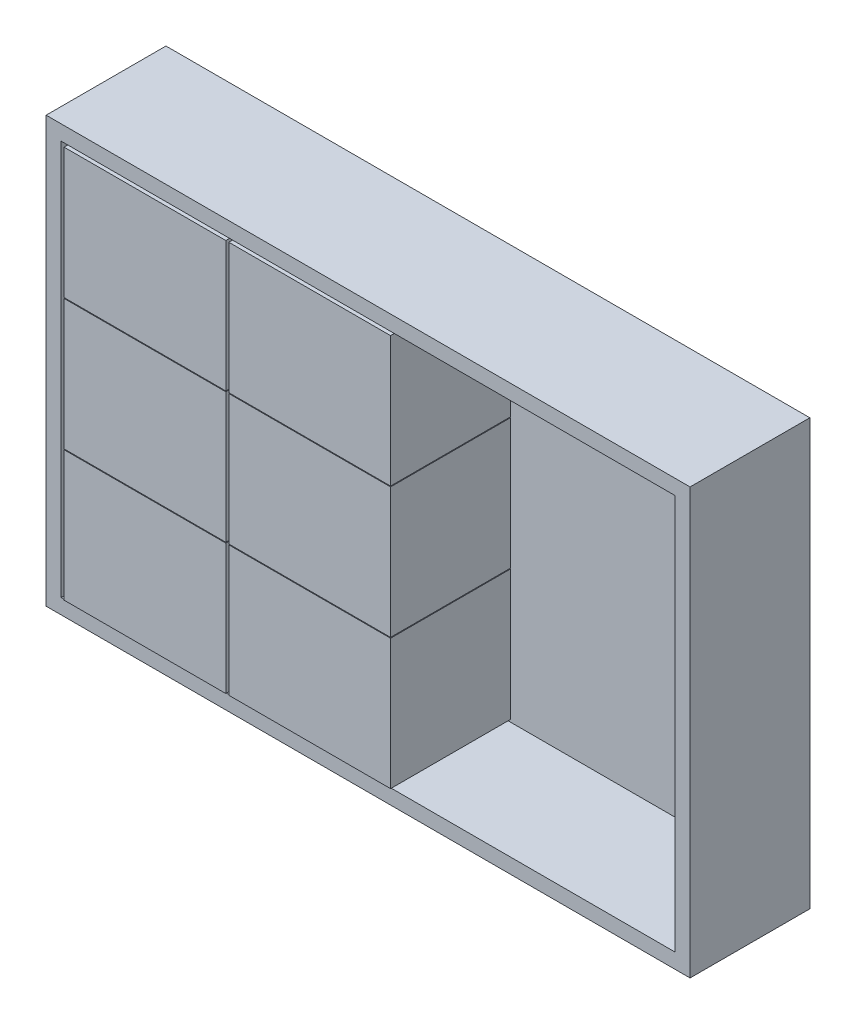
ISO-10303-21;
HEADER;
FILE_DESCRIPTION(('STEP AP214'),'2;1');
FILE_NAME('part.step','',(''),(''),'','','');
FILE_SCHEMA(('AUTOMOTIVE_DESIGN { 1 0 10303 214 1 1 1 1 }'));
ENDSEC;
DATA;
#1=APPLICATION_CONTEXT('core data for automotive mechanical design processes');
#2=APPLICATION_PROTOCOL_DEFINITION('international standard','automotive_design',2000,#1);
#3=PRODUCT_CONTEXT('',#1,'mechanical');
#4=PRODUCT('Part','Part','',(#3));
#5=PRODUCT_RELATED_PRODUCT_CATEGORY('part','',(#4));
#6=PRODUCT_DEFINITION_FORMATION('','',#4);
#7=PRODUCT_DEFINITION_CONTEXT('part definition',#1,'design');
#8=PRODUCT_DEFINITION('design','',#6,#7);
#9=PRODUCT_DEFINITION_SHAPE('','',#8);
#10=(LENGTH_UNIT() NAMED_UNIT(*) SI_UNIT(.MILLI.,.METRE.));
#11=(NAMED_UNIT(*) PLANE_ANGLE_UNIT() SI_UNIT($,.RADIAN.));
#12=(NAMED_UNIT(*) SI_UNIT($,.STERADIAN.) SOLID_ANGLE_UNIT());
#13=UNCERTAINTY_MEASURE_WITH_UNIT(LENGTH_MEASURE(1.E-05),#10,'distance_accuracy_value','');
#14=(GEOMETRIC_REPRESENTATION_CONTEXT(3) GLOBAL_UNCERTAINTY_ASSIGNED_CONTEXT((#13)) GLOBAL_UNIT_ASSIGNED_CONTEXT((#10,
#11,#12)) REPRESENTATION_CONTEXT('',''));
#15=CARTESIAN_POINT('',(0.,0.,0.));
#16=DIRECTION('',(0.,0.,1.));
#17=DIRECTION('',(1.,0.,0.));
#18=AXIS2_PLACEMENT_3D('',#15,#16,#17);
#19=CARTESIAN_POINT('',(0.,0.,1.));
#20=DIRECTION('',(0.,0.,-1.));
#21=DIRECTION('',(-1.,0.,0.));
#22=AXIS2_PLACEMENT_3D('',#19,#20,#21);
#23=PLANE('',#22);
#24=DIRECTION('',(0.,-1.,0.));
#25=VECTOR('',#24,1.);
#26=CARTESIAN_POINT('',(57.,88.,1.));
#27=LINE('',#26,#25);
#28=CARTESIAN_POINT('',(57.,88.,1.));
#29=VERTEX_POINT('',#28);
#30=CARTESIAN_POINT('',(57.,44.5,1.));
#31=VERTEX_POINT('',#30);
#32=EDGE_CURVE('E322',#29,#31,#27,.T.);
#33=ORIENTED_EDGE('',*,*,#32,.F.);
#34=DIRECTION('',(-1.,0.,0.));
#35=VECTOR('',#34,1.);
#36=CARTESIAN_POINT('',(57.,88.,1.));
#37=LINE('',#36,#35);
#38=CARTESIAN_POINT('',(111.,88.,1.));
#39=VERTEX_POINT('',#38);
#40=EDGE_CURVE('E288',#39,#29,#37,.T.);
#41=ORIENTED_EDGE('',*,*,#40,.F.);
#42=DIRECTION('',(0.,1.,0.));
#43=VECTOR('',#42,1.);
#44=CARTESIAN_POINT('',(111.,88.,1.));
#45=LINE('',#44,#43);
#46=CARTESIAN_POINT('',(111.,44.5,1.));
#47=VERTEX_POINT('',#46);
#48=EDGE_CURVE('E310',#47,#39,#45,.T.);
#49=ORIENTED_EDGE('',*,*,#48,.F.);
#50=DIRECTION('',(1.,0.,0.));
#51=VECTOR('',#50,1.);
#52=CARTESIAN_POINT('',(57.,44.5,1.));
#53=LINE('',#52,#51);
#54=EDGE_CURVE('E316',#31,#47,#53,.T.);
#55=ORIENTED_EDGE('',*,*,#54,.F.);
#56=EDGE_LOOP('',(#33,#41,#49,#55));
#57=FACE_BOUND('',#56,.T.);
#58=DIRECTION('',(0.,-1.,0.));
#59=VECTOR('',#58,1.);
#60=CARTESIAN_POINT('',(2.,44.25,1.));
#61=LINE('',#60,#59);
#62=CARTESIAN_POINT('',(2.,44.25,1.));
#63=VERTEX_POINT('',#62);
#64=CARTESIAN_POINT('',(2.00000000000001,0.750000000000015,1.));
#65=VERTEX_POINT('',#64);
#66=EDGE_CURVE('E388',#63,#65,#61,.T.);
#67=ORIENTED_EDGE('',*,*,#66,.F.);
#68=DIRECTION('',(-1.,0.,0.));
#69=VECTOR('',#68,1.);
#70=CARTESIAN_POINT('',(2.,44.25,1.));
#71=LINE('',#70,#69);
#72=CARTESIAN_POINT('',(56.,44.25,1.));
#73=VERTEX_POINT('',#72);
#74=EDGE_CURVE('E358',#73,#63,#71,.T.);
#75=ORIENTED_EDGE('',*,*,#74,.F.);
#76=DIRECTION('',(0.,1.,0.));
#77=VECTOR('',#76,1.);
#78=CARTESIAN_POINT('',(56.,44.25,1.));
#79=LINE('',#78,#77);
#80=CARTESIAN_POINT('',(56.,0.750000000000015,1.));
#81=VERTEX_POINT('',#80);
#82=EDGE_CURVE('E376',#81,#73,#79,.T.);
#83=ORIENTED_EDGE('',*,*,#82,.F.);
#84=DIRECTION('',(1.,0.,0.));
#85=VECTOR('',#84,1.);
#86=CARTESIAN_POINT('',(2.00000000000001,0.750000000000015,1.));
#87=LINE('',#86,#85);
#88=EDGE_CURVE('E382',#65,#81,#87,.T.);
#89=ORIENTED_EDGE('',*,*,#88,.F.);
#90=EDGE_LOOP('',(#67,#75,#83,#89));
#91=FACE_BOUND('',#90,.T.);
#92=DIRECTION('',(0.,-1.,0.));
#93=VECTOR('',#92,1.);
#94=CARTESIAN_POINT('',(2.,131.75,1.));
#95=LINE('',#94,#93);
#96=CARTESIAN_POINT('',(2.,131.75,1.));
#97=VERTEX_POINT('',#96);
#98=CARTESIAN_POINT('',(2.00000000000001,88.25,1.));
#99=VERTEX_POINT('',#98);
#100=EDGE_CURVE('E424',#97,#99,#95,.T.);
#101=ORIENTED_EDGE('',*,*,#100,.F.);
#102=DIRECTION('',(-1.,0.,0.));
#103=VECTOR('',#102,1.);
#104=CARTESIAN_POINT('',(2.,131.75,1.));
#105=LINE('',#104,#103);
#106=CARTESIAN_POINT('',(56.,131.75,1.));
#107=VERTEX_POINT('',#106);
#108=EDGE_CURVE('E429',#107,#97,#105,.T.);
#109=ORIENTED_EDGE('',*,*,#108,.F.);
#110=DIRECTION('',(0.,1.,0.));
#111=VECTOR('',#110,1.);
#112=CARTESIAN_POINT('',(56.,131.75,1.));
#113=LINE('',#112,#111);
#114=CARTESIAN_POINT('',(56.,88.25,1.));
#115=VERTEX_POINT('',#114);
#116=EDGE_CURVE('E441',#115,#107,#113,.T.);
#117=ORIENTED_EDGE('',*,*,#116,.F.);
#118=DIRECTION('',(1.,0.,0.));
#119=VECTOR('',#118,1.);
#120=CARTESIAN_POINT('',(2.00000000000001,88.25,1.));
#121=LINE('',#120,#119);
#122=EDGE_CURVE('E438',#99,#115,#121,.T.);
#123=ORIENTED_EDGE('',*,*,#122,.F.);
#124=EDGE_LOOP('',(#101,#109,#117,#123));
#125=FACE_BOUND('',#124,.T.);
#126=DIRECTION('',(0.,-1.,0.));
#127=VECTOR('',#126,1.);
#128=CARTESIAN_POINT('',(0.,0.,1.));
#129=LINE('',#128,#127);
#130=CARTESIAN_POINT('',(0.,132.,1.));
#131=VERTEX_POINT('',#130);
#132=CARTESIAN_POINT('',(0.,0.,1.));
#133=VERTEX_POINT('',#132);
#134=EDGE_CURVE('E507',#131,#133,#129,.T.);
#135=ORIENTED_EDGE('',*,*,#134,.T.);
#136=DIRECTION('',(1.,0.,0.));
#137=VECTOR('',#136,1.);
#138=CARTESIAN_POINT('',(0.,0.,1.));
#139=LINE('',#138,#137);
#140=CARTESIAN_POINT('',(205.,0.,1.));
#141=VERTEX_POINT('',#140);
#142=EDGE_CURVE('E510',#133,#141,#139,.T.);
#143=ORIENTED_EDGE('',*,*,#142,.T.);
#144=DIRECTION('',(0.,1.,0.));
#145=VECTOR('',#144,1.);
#146=CARTESIAN_POINT('',(205.,0.,1.));
#147=LINE('',#146,#145);
#148=CARTESIAN_POINT('',(205.,132.,1.));
#149=VERTEX_POINT('',#148);
#150=EDGE_CURVE('E65',#141,#149,#147,.T.);
#151=ORIENTED_EDGE('',*,*,#150,.T.);
#152=DIRECTION('',(-1.,0.,0.));
#153=VECTOR('',#152,1.);
#154=CARTESIAN_POINT('',(0.,132.,1.));
#155=LINE('',#154,#153);
#156=EDGE_CURVE('E12',#149,#131,#155,.T.);
#157=ORIENTED_EDGE('',*,*,#156,.T.);
#158=EDGE_LOOP('',(#135,#143,#151,#157));
#159=FACE_BOUND('',#158,.T.);
#160=DIRECTION('',(0.,-1.,0.));
#161=VECTOR('',#160,1.);
#162=CARTESIAN_POINT('',(2.,88.,1.));
#163=LINE('',#162,#161);
#164=CARTESIAN_POINT('',(2.,88.,1.));
#165=VERTEX_POINT('',#164);
#166=CARTESIAN_POINT('',(2.00000000000001,44.5,1.));
#167=VERTEX_POINT('',#166);
#168=EDGE_CURVE('E421',#165,#167,#163,.T.);
#169=ORIENTED_EDGE('',*,*,#168,.F.);
#170=DIRECTION('',(-1.,0.,0.));
#171=VECTOR('',#170,1.);
#172=CARTESIAN_POINT('',(2.,88.,1.));
#173=LINE('',#172,#171);
#174=CARTESIAN_POINT('',(56.,88.,1.));
#175=VERTEX_POINT('',#174);
#176=EDGE_CURVE('E391',#175,#165,#173,.T.);
#177=ORIENTED_EDGE('',*,*,#176,.F.);
#178=DIRECTION('',(0.,1.,0.));
#179=VECTOR('',#178,1.);
#180=CARTESIAN_POINT('',(56.,88.,1.));
#181=LINE('',#180,#179);
#182=CARTESIAN_POINT('',(56.,44.5,1.));
#183=VERTEX_POINT('',#182);
#184=EDGE_CURVE('E409',#183,#175,#181,.T.);
#185=ORIENTED_EDGE('',*,*,#184,.F.);
#186=DIRECTION('',(1.,0.,0.));
#187=VECTOR('',#186,1.);
#188=CARTESIAN_POINT('',(2.00000000000001,44.5,1.));
#189=LINE('',#188,#187);
#190=EDGE_CURVE('E415',#167,#183,#189,.T.);
#191=ORIENTED_EDGE('',*,*,#190,.F.);
#192=EDGE_LOOP('',(#169,#177,#185,#191));
#193=FACE_BOUND('',#192,.T.);
#194=DIRECTION('',(0.,-1.,0.));
#195=VECTOR('',#194,1.);
#196=CARTESIAN_POINT('',(57.,131.75,1.));
#197=LINE('',#196,#195);
#198=CARTESIAN_POINT('',(57.,131.75,1.));
#199=VERTEX_POINT('',#198);
#200=CARTESIAN_POINT('',(57.,88.25,1.));
#201=VERTEX_POINT('',#200);
#202=EDGE_CURVE('E355',#199,#201,#197,.T.);
#203=ORIENTED_EDGE('',*,*,#202,.F.);
#204=DIRECTION('',(-1.,0.,0.));
#205=VECTOR('',#204,1.);
#206=CARTESIAN_POINT('',(57.,131.75,1.));
#207=LINE('',#206,#205);
#208=CARTESIAN_POINT('',(111.,131.75,1.));
#209=VERTEX_POINT('',#208);
#210=EDGE_CURVE('E325',#209,#199,#207,.T.);
#211=ORIENTED_EDGE('',*,*,#210,.F.);
#212=DIRECTION('',(0.,1.,0.));
#213=VECTOR('',#212,1.);
#214=CARTESIAN_POINT('',(111.,131.75,1.));
#215=LINE('',#214,#213);
#216=CARTESIAN_POINT('',(111.,88.25,1.));
#217=VERTEX_POINT('',#216);
#218=EDGE_CURVE('E343',#217,#209,#215,.T.);
#219=ORIENTED_EDGE('',*,*,#218,.F.);
#220=DIRECTION('',(1.,0.,0.));
#221=VECTOR('',#220,1.);
#222=CARTESIAN_POINT('',(57.,88.25,1.));
#223=LINE('',#222,#221);
#224=EDGE_CURVE('E349',#201,#217,#223,.T.);
#225=ORIENTED_EDGE('',*,*,#224,.F.);
#226=EDGE_LOOP('',(#203,#211,#219,#225));
#227=FACE_BOUND('',#226,.T.);
#228=DIRECTION('',(0.,-1.,0.));
#229=VECTOR('',#228,1.);
#230=CARTESIAN_POINT('',(57.,44.25,1.));
#231=LINE('',#230,#229);
#232=CARTESIAN_POINT('',(57.,44.25,1.));
#233=VERTEX_POINT('',#232);
#234=CARTESIAN_POINT('',(57.,0.750000000000015,1.));
#235=VERTEX_POINT('',#234);
#236=EDGE_CURVE('E286',#233,#235,#231,.T.);
#237=ORIENTED_EDGE('',*,*,#236,.F.);
#238=DIRECTION('',(-1.,0.,0.));
#239=VECTOR('',#238,1.);
#240=CARTESIAN_POINT('',(57.,44.25,1.));
#241=LINE('',#240,#239);
#242=CARTESIAN_POINT('',(111.,44.25,1.));
#243=VERTEX_POINT('',#242);
#244=EDGE_CURVE('E275',#243,#233,#241,.T.);
#245=ORIENTED_EDGE('',*,*,#244,.F.);
#246=DIRECTION('',(0.,1.,0.));
#247=VECTOR('',#246,1.);
#248=CARTESIAN_POINT('',(111.,44.25,1.));
#249=LINE('',#248,#247);
#250=CARTESIAN_POINT('',(111.,0.750000000000015,1.));
#251=VERTEX_POINT('',#250);
#252=EDGE_CURVE('E77',#251,#243,#249,.T.);
#253=ORIENTED_EDGE('',*,*,#252,.F.);
#254=DIRECTION('',(1.,0.,0.));
#255=VECTOR('',#254,1.);
#256=CARTESIAN_POINT('',(57.,0.750000000000015,1.));
#257=LINE('',#256,#255);
#258=EDGE_CURVE('E72',#235,#251,#257,.T.);
#259=ORIENTED_EDGE('',*,*,#258,.F.);
#260=EDGE_LOOP('',(#237,#245,#253,#259));
#261=FACE_BOUND('',#260,.T.);
#262=ADVANCED_FACE('F57',(#57,#91,#125,#159,#193,#227,#261),#23,.F.);
#263=CARTESIAN_POINT('',(0.,0.,40.));
#264=DIRECTION('',(1.,0.,0.));
#265=DIRECTION('',(0.,0.,-1.));
#266=AXIS2_PLACEMENT_3D('',#263,#264,#265);
#267=PLANE('',#266);
#268=ORIENTED_EDGE('',*,*,#134,.F.);
#269=DIRECTION('',(0.,0.,-1.));
#270=VECTOR('',#269,1.);
#271=CARTESIAN_POINT('',(0.,132.,40.));
#272=LINE('',#271,#270);
#273=CARTESIAN_POINT('',(0.,132.,40.));
#274=VERTEX_POINT('',#273);
#275=EDGE_CURVE('E466',#274,#131,#272,.T.);
#276=ORIENTED_EDGE('',*,*,#275,.F.);
#277=DIRECTION('',(0.,-1.,0.));
#278=VECTOR('',#277,1.);
#279=CARTESIAN_POINT('',(0.,0.,40.));
#280=LINE('',#279,#278);
#281=CARTESIAN_POINT('',(0.,0.,40.));
#282=VERTEX_POINT('',#281);
#283=EDGE_CURVE('E457',#274,#282,#280,.T.);
#284=ORIENTED_EDGE('',*,*,#283,.T.);
#285=DIRECTION('',(0.,0.,-1.));
#286=VECTOR('',#285,1.);
#287=CARTESIAN_POINT('',(0.,0.,40.));
#288=LINE('',#287,#286);
#289=EDGE_CURVE('E474',#282,#133,#288,.T.);
#290=ORIENTED_EDGE('',*,*,#289,.T.);
#291=EDGE_LOOP('',(#268,#276,#284,#290));
#292=FACE_BOUND('',#291,.T.);
#293=ADVANCED_FACE('F532',(#292),#267,.T.);
#294=CARTESIAN_POINT('',(0.,0.,40.));
#295=DIRECTION('',(0.,1.,0.));
#296=DIRECTION('',(0.,0.,1.));
#297=AXIS2_PLACEMENT_3D('',#294,#295,#296);
#298=PLANE('',#297);
#299=ORIENTED_EDGE('',*,*,#142,.F.);
#300=ORIENTED_EDGE('',*,*,#289,.F.);
#301=DIRECTION('',(1.,0.,0.));
#302=VECTOR('',#301,1.);
#303=CARTESIAN_POINT('',(0.,0.,40.));
#304=LINE('',#303,#302);
#305=CARTESIAN_POINT('',(205.,0.,40.));
#306=VERTEX_POINT('',#305);
#307=EDGE_CURVE('E459',#282,#306,#304,.T.);
#308=ORIENTED_EDGE('',*,*,#307,.T.);
#309=DIRECTION('',(0.,0.,-1.));
#310=VECTOR('',#309,1.);
#311=CARTESIAN_POINT('',(205.,0.,40.));
#312=LINE('',#311,#310);
#313=EDGE_CURVE('E471',#306,#141,#312,.T.);
#314=ORIENTED_EDGE('',*,*,#313,.T.);
#315=EDGE_LOOP('',(#299,#300,#308,#314));
#316=FACE_BOUND('',#315,.T.);
#317=ADVANCED_FACE('F520',(#316),#298,.T.);
#318=CARTESIAN_POINT('',(205.,0.,40.));
#319=DIRECTION('',(-1.,0.,0.));
#320=DIRECTION('',(0.,0.,1.));
#321=AXIS2_PLACEMENT_3D('',#318,#319,#320);
#322=PLANE('',#321);
#323=ORIENTED_EDGE('',*,*,#150,.F.);
#324=ORIENTED_EDGE('',*,*,#313,.F.);
#325=DIRECTION('',(0.,1.,0.));
#326=VECTOR('',#325,1.);
#327=CARTESIAN_POINT('',(205.,0.,40.));
#328=LINE('',#327,#326);
#329=CARTESIAN_POINT('',(205.,132.,40.));
#330=VERTEX_POINT('',#329);
#331=EDGE_CURVE('E461',#306,#330,#328,.T.);
#332=ORIENTED_EDGE('',*,*,#331,.T.);
#333=DIRECTION('',(0.,0.,-1.));
#334=VECTOR('',#333,1.);
#335=CARTESIAN_POINT('',(205.,132.,40.));
#336=LINE('',#335,#334);
#337=EDGE_CURVE('E468',#330,#149,#336,.T.);
#338=ORIENTED_EDGE('',*,*,#337,.T.);
#339=EDGE_LOOP('',(#323,#324,#332,#338));
#340=FACE_BOUND('',#339,.T.);
#341=ADVANCED_FACE('F517',(#340),#322,.T.);
#342=CARTESIAN_POINT('',(0.,132.,40.));
#343=DIRECTION('',(0.,-1.,0.));
#344=DIRECTION('',(0.,0.,-1.));
#345=AXIS2_PLACEMENT_3D('',#342,#343,#344);
#346=PLANE('',#345);
#347=ORIENTED_EDGE('',*,*,#156,.F.);
#348=ORIENTED_EDGE('',*,*,#337,.F.);
#349=DIRECTION('',(-1.,0.,0.));
#350=VECTOR('',#349,1.);
#351=CARTESIAN_POINT('',(0.,132.,40.));
#352=LINE('',#351,#350);
#353=EDGE_CURVE('E464',#330,#274,#352,.T.);
#354=ORIENTED_EDGE('',*,*,#353,.T.);
#355=ORIENTED_EDGE('',*,*,#275,.T.);
#356=EDGE_LOOP('',(#347,#348,#354,#355));
#357=FACE_BOUND('',#356,.T.);
#358=ADVANCED_FACE('F529',(#357),#346,.T.);
#359=CARTESIAN_POINT('',(0.,0.,40.));
#360=DIRECTION('',(0.,0.,1.));
#361=DIRECTION('',(1.,0.,0.));
#362=AXIS2_PLACEMENT_3D('',#359,#360,#361);
#363=PLANE('',#362);
#364=DIRECTION('',(0.,-1.,0.));
#365=VECTOR('',#364,1.);
#366=CARTESIAN_POINT('',(-5.,0.,40.));
#367=LINE('',#366,#365);
#368=CARTESIAN_POINT('',(-5.,137.,40.));
#369=VERTEX_POINT('',#368);
#370=CARTESIAN_POINT('',(-5.,-5.,40.));
#371=VERTEX_POINT('',#370);
#372=EDGE_CURVE('E478',#369,#371,#367,.T.);
#373=ORIENTED_EDGE('',*,*,#372,.T.);
#374=DIRECTION('',(1.,0.,0.));
#375=VECTOR('',#374,1.);
#376=CARTESIAN_POINT('',(0.,-5.,40.));
#377=LINE('',#376,#375);
#378=CARTESIAN_POINT('',(210.,-5.,40.));
#379=VERTEX_POINT('',#378);
#380=EDGE_CURVE('E481',#371,#379,#377,.T.);
#381=ORIENTED_EDGE('',*,*,#380,.T.);
#382=DIRECTION('',(0.,1.,0.));
#383=VECTOR('',#382,1.);
#384=CARTESIAN_POINT('',(210.,0.,40.));
#385=LINE('',#384,#383);
#386=CARTESIAN_POINT('',(210.,137.,40.));
#387=VERTEX_POINT('',#386);
#388=EDGE_CURVE('E484',#379,#387,#385,.T.);
#389=ORIENTED_EDGE('',*,*,#388,.T.);
#390=DIRECTION('',(-1.,0.,0.));
#391=VECTOR('',#390,1.);
#392=CARTESIAN_POINT('',(0.,137.,40.));
#393=LINE('',#392,#391);
#394=EDGE_CURVE('E486',#387,#369,#393,.T.);
#395=ORIENTED_EDGE('',*,*,#394,.T.);
#396=EDGE_LOOP('',(#373,#381,#389,#395));
#397=FACE_BOUND('',#396,.T.);
#398=ORIENTED_EDGE('',*,*,#307,.F.);
#399=ORIENTED_EDGE('',*,*,#283,.F.);
#400=ORIENTED_EDGE('',*,*,#353,.F.);
#401=ORIENTED_EDGE('',*,*,#331,.F.);
#402=EDGE_LOOP('',(#398,#399,#400,#401));
#403=FACE_BOUND('',#402,.T.);
#404=ADVANCED_FACE('F525',(#397,#403),#363,.T.);
#405=CARTESIAN_POINT('',(-5.,0.,40.));
#406=DIRECTION('',(1.,0.,0.));
#407=DIRECTION('',(0.,0.,-1.));
#408=AXIS2_PLACEMENT_3D('',#405,#406,#407);
#409=PLANE('',#408);
#410=DIRECTION('',(0.,-1.,0.));
#411=VECTOR('',#410,1.);
#412=CARTESIAN_POINT('',(-5.,0.,0.));
#413=LINE('',#412,#411);
#414=CARTESIAN_POINT('',(-5.,137.,0.));
#415=VERTEX_POINT('',#414);
#416=CARTESIAN_POINT('',(-5.,-5.,0.));
#417=VERTEX_POINT('',#416);
#418=EDGE_CURVE('E477',#415,#417,#413,.T.);
#419=ORIENTED_EDGE('',*,*,#418,.T.);
#420=DIRECTION('',(0.,0.,-1.));
#421=VECTOR('',#420,1.);
#422=CARTESIAN_POINT('',(-5.,-5.,40.));
#423=LINE('',#422,#421);
#424=EDGE_CURVE('E504',#371,#417,#423,.T.);
#425=ORIENTED_EDGE('',*,*,#424,.F.);
#426=ORIENTED_EDGE('',*,*,#372,.F.);
#427=DIRECTION('',(0.,0.,-1.));
#428=VECTOR('',#427,1.);
#429=CARTESIAN_POINT('',(-5.,137.,40.));
#430=LINE('',#429,#428);
#431=EDGE_CURVE('E488',#369,#415,#430,.T.);
#432=ORIENTED_EDGE('',*,*,#431,.T.);
#433=EDGE_LOOP('',(#419,#425,#426,#432));
#434=FACE_BOUND('',#433,.T.);
#435=ADVANCED_FACE('F545',(#434),#409,.F.);
#436=CARTESIAN_POINT('',(0.,-5.,40.));
#437=DIRECTION('',(0.,1.,0.));
#438=DIRECTION('',(0.,0.,1.));
#439=AXIS2_PLACEMENT_3D('',#436,#437,#438);
#440=PLANE('',#439);
#441=DIRECTION('',(1.,0.,0.));
#442=VECTOR('',#441,1.);
#443=CARTESIAN_POINT('',(0.,-5.,0.));
#444=LINE('',#443,#442);
#445=CARTESIAN_POINT('',(210.,-5.,0.));
#446=VERTEX_POINT('',#445);
#447=EDGE_CURVE('E491',#417,#446,#444,.T.);
#448=ORIENTED_EDGE('',*,*,#447,.T.);
#449=DIRECTION('',(0.,0.,-1.));
#450=VECTOR('',#449,1.);
#451=CARTESIAN_POINT('',(210.,-5.,40.));
#452=LINE('',#451,#450);
#453=EDGE_CURVE('E501',#379,#446,#452,.T.);
#454=ORIENTED_EDGE('',*,*,#453,.F.);
#455=ORIENTED_EDGE('',*,*,#380,.F.);
#456=ORIENTED_EDGE('',*,*,#424,.T.);
#457=EDGE_LOOP('',(#448,#454,#455,#456));
#458=FACE_BOUND('',#457,.T.);
#459=ADVANCED_FACE('F554',(#458),#440,.F.);
#460=CARTESIAN_POINT('',(210.,0.,40.));
#461=DIRECTION('',(-1.,0.,0.));
#462=DIRECTION('',(0.,0.,1.));
#463=AXIS2_PLACEMENT_3D('',#460,#461,#462);
#464=PLANE('',#463);
#465=DIRECTION('',(0.,1.,0.));
#466=VECTOR('',#465,1.);
#467=CARTESIAN_POINT('',(210.,0.,0.));
#468=LINE('',#467,#466);
#469=CARTESIAN_POINT('',(210.,137.,0.));
#470=VERTEX_POINT('',#469);
#471=EDGE_CURVE('E493',#446,#470,#468,.T.);
#472=ORIENTED_EDGE('',*,*,#471,.T.);
#473=DIRECTION('',(0.,0.,-1.));
#474=VECTOR('',#473,1.);
#475=CARTESIAN_POINT('',(210.,137.,40.));
#476=LINE('',#475,#474);
#477=EDGE_CURVE('E498',#387,#470,#476,.T.);
#478=ORIENTED_EDGE('',*,*,#477,.F.);
#479=ORIENTED_EDGE('',*,*,#388,.F.);
#480=ORIENTED_EDGE('',*,*,#453,.T.);
#481=EDGE_LOOP('',(#472,#478,#479,#480));
#482=FACE_BOUND('',#481,.T.);
#483=ADVANCED_FACE('F550',(#482),#464,.F.);
#484=CARTESIAN_POINT('',(0.,137.,40.));
#485=DIRECTION('',(0.,-1.,0.));
#486=DIRECTION('',(0.,0.,-1.));
#487=AXIS2_PLACEMENT_3D('',#484,#485,#486);
#488=PLANE('',#487);
#489=DIRECTION('',(-1.,0.,0.));
#490=VECTOR('',#489,1.);
#491=CARTESIAN_POINT('',(0.,137.,0.));
#492=LINE('',#491,#490);
#493=EDGE_CURVE('E482',#470,#415,#492,.T.);
#494=ORIENTED_EDGE('',*,*,#493,.T.);
#495=ORIENTED_EDGE('',*,*,#431,.F.);
#496=ORIENTED_EDGE('',*,*,#394,.F.);
#497=ORIENTED_EDGE('',*,*,#477,.T.);
#498=EDGE_LOOP('',(#494,#495,#496,#497));
#499=FACE_BOUND('',#498,.T.);
#500=ADVANCED_FACE('F547',(#499),#488,.F.);
#501=CARTESIAN_POINT('',(0.,0.,0.));
#502=DIRECTION('',(0.,0.,-1.));
#503=DIRECTION('',(-1.,0.,0.));
#504=AXIS2_PLACEMENT_3D('',#501,#502,#503);
#505=PLANE('',#504);
#506=ORIENTED_EDGE('',*,*,#418,.F.);
#507=ORIENTED_EDGE('',*,*,#493,.F.);
#508=ORIENTED_EDGE('',*,*,#471,.F.);
#509=ORIENTED_EDGE('',*,*,#447,.F.);
#510=EDGE_LOOP('',(#506,#507,#508,#509));
#511=FACE_BOUND('',#510,.T.);
#512=ADVANCED_FACE('F59',(#511),#505,.T.);
#513=CARTESIAN_POINT('',(2.,131.75,41.));
#514=DIRECTION('',(1.,0.,0.));
#515=DIRECTION('',(0.,1.,0.));
#516=AXIS2_PLACEMENT_3D('',#513,#514,#515);
#517=PLANE('',#516);
#518=ORIENTED_EDGE('',*,*,#100,.T.);
#519=DIRECTION('',(0.,0.,-1.));
#520=VECTOR('',#519,1.);
#521=CARTESIAN_POINT('',(2.00000000000001,88.25,41.));
#522=LINE('',#521,#520);
#523=CARTESIAN_POINT('',(2.00000000000001,88.25,41.));
#524=VERTEX_POINT('',#523);
#525=EDGE_CURVE('E454',#524,#99,#522,.T.);
#526=ORIENTED_EDGE('',*,*,#525,.F.);
#527=DIRECTION('',(0.,-1.,0.));
#528=VECTOR('',#527,1.);
#529=CARTESIAN_POINT('',(2.,131.75,41.));
#530=LINE('',#529,#528);
#531=CARTESIAN_POINT('',(2.,131.75,41.));
#532=VERTEX_POINT('',#531);
#533=EDGE_CURVE('E425',#532,#524,#530,.T.);
#534=ORIENTED_EDGE('',*,*,#533,.F.);
#535=DIRECTION('',(0.,0.,-1.));
#536=VECTOR('',#535,1.);
#537=CARTESIAN_POINT('',(2.,131.75,41.));
#538=LINE('',#537,#536);
#539=EDGE_CURVE('E435',#532,#97,#538,.T.);
#540=ORIENTED_EDGE('',*,*,#539,.T.);
#541=EDGE_LOOP('',(#518,#526,#534,#540));
#542=FACE_BOUND('',#541,.T.);
#543=ADVANCED_FACE('F575',(#542),#517,.F.);
#544=CARTESIAN_POINT('',(2.00000000000001,88.25,41.));
#545=DIRECTION('',(0.,1.,0.));
#546=DIRECTION('',(0.,0.,1.));
#547=AXIS2_PLACEMENT_3D('',#544,#545,#546);
#548=PLANE('',#547);
#549=ORIENTED_EDGE('',*,*,#122,.T.);
#550=DIRECTION('',(0.,0.,-1.));
#551=VECTOR('',#550,1.);
#552=CARTESIAN_POINT('',(56.,88.25,41.));
#553=LINE('',#552,#551);
#554=CARTESIAN_POINT('',(56.,88.25,41.));
#555=VERTEX_POINT('',#554);
#556=EDGE_CURVE('E451',#555,#115,#553,.T.);
#557=ORIENTED_EDGE('',*,*,#556,.F.);
#558=DIRECTION('',(1.,0.,0.));
#559=VECTOR('',#558,1.);
#560=CARTESIAN_POINT('',(2.00000000000001,88.25,41.));
#561=LINE('',#560,#559);
#562=EDGE_CURVE('E428',#524,#555,#561,.T.);
#563=ORIENTED_EDGE('',*,*,#562,.F.);
#564=ORIENTED_EDGE('',*,*,#525,.T.);
#565=EDGE_LOOP('',(#549,#557,#563,#564));
#566=FACE_BOUND('',#565,.T.);
#567=ADVANCED_FACE('F579',(#566),#548,.F.);
#568=CARTESIAN_POINT('',(56.,131.75,41.));
#569=DIRECTION('',(-1.,0.,0.));
#570=DIRECTION('',(0.,-1.,0.));
#571=AXIS2_PLACEMENT_3D('',#568,#569,#570);
#572=PLANE('',#571);
#573=ORIENTED_EDGE('',*,*,#116,.T.);
#574=DIRECTION('',(0.,0.,-1.));
#575=VECTOR('',#574,1.);
#576=CARTESIAN_POINT('',(56.,131.75,41.));
#577=LINE('',#576,#575);
#578=CARTESIAN_POINT('',(56.,131.75,41.));
#579=VERTEX_POINT('',#578);
#580=EDGE_CURVE('E448',#579,#107,#577,.T.);
#581=ORIENTED_EDGE('',*,*,#580,.F.);
#582=DIRECTION('',(0.,1.,0.));
#583=VECTOR('',#582,1.);
#584=CARTESIAN_POINT('',(56.,131.75,41.));
#585=LINE('',#584,#583);
#586=EDGE_CURVE('E431',#555,#579,#585,.T.);
#587=ORIENTED_EDGE('',*,*,#586,.F.);
#588=ORIENTED_EDGE('',*,*,#556,.T.);
#589=EDGE_LOOP('',(#573,#581,#587,#588));
#590=FACE_BOUND('',#589,.T.);
#591=ADVANCED_FACE('F585',(#590),#572,.F.);
#592=CARTESIAN_POINT('',(2.,131.75,41.));
#593=DIRECTION('',(0.,-1.,0.));
#594=DIRECTION('',(0.,0.,-1.));
#595=AXIS2_PLACEMENT_3D('',#592,#593,#594);
#596=PLANE('',#595);
#597=ORIENTED_EDGE('',*,*,#108,.T.);
#598=ORIENTED_EDGE('',*,*,#539,.F.);
#599=DIRECTION('',(-1.,0.,0.));
#600=VECTOR('',#599,1.);
#601=CARTESIAN_POINT('',(2.,131.75,41.));
#602=LINE('',#601,#600);
#603=EDGE_CURVE('E433',#579,#532,#602,.T.);
#604=ORIENTED_EDGE('',*,*,#603,.F.);
#605=ORIENTED_EDGE('',*,*,#580,.T.);
#606=EDGE_LOOP('',(#597,#598,#604,#605));
#607=FACE_BOUND('',#606,.T.);
#608=ADVANCED_FACE('F650',(#607),#596,.F.);
#609=CARTESIAN_POINT('',(0.,0.,41.));
#610=DIRECTION('',(0.,0.,1.));
#611=DIRECTION('',(1.,0.,0.));
#612=AXIS2_PLACEMENT_3D('',#609,#610,#611);
#613=PLANE('',#612);
#614=ORIENTED_EDGE('',*,*,#533,.T.);
#615=ORIENTED_EDGE('',*,*,#562,.T.);
#616=ORIENTED_EDGE('',*,*,#586,.T.);
#617=ORIENTED_EDGE('',*,*,#603,.T.);
#618=EDGE_LOOP('',(#614,#615,#616,#617));
#619=FACE_BOUND('',#618,.T.);
#620=ADVANCED_FACE('F659',(#619),#613,.T.);
#621=CARTESIAN_POINT('',(2.,88.,41.));
#622=DIRECTION('',(1.,0.,0.));
#623=DIRECTION('',(0.,1.,0.));
#624=AXIS2_PLACEMENT_3D('',#621,#622,#623);
#625=PLANE('',#624);
#626=ORIENTED_EDGE('',*,*,#168,.T.);
#627=DIRECTION('',(0.,0.,-1.));
#628=VECTOR('',#627,1.);
#629=CARTESIAN_POINT('',(2.00000000000001,44.5,41.));
#630=LINE('',#629,#628);
#631=CARTESIAN_POINT('',(2.00000000000001,44.5,41.));
#632=VERTEX_POINT('',#631);
#633=EDGE_CURVE('E418',#632,#167,#630,.T.);
#634=ORIENTED_EDGE('',*,*,#633,.F.);
#635=DIRECTION('',(0.,-1.,0.));
#636=VECTOR('',#635,1.);
#637=CARTESIAN_POINT('',(2.,88.,41.));
#638=LINE('',#637,#636);
#639=CARTESIAN_POINT('',(2.,88.,41.));
#640=VERTEX_POINT('',#639);
#641=EDGE_CURVE('E394',#640,#632,#638,.T.);
#642=ORIENTED_EDGE('',*,*,#641,.F.);
#643=DIRECTION('',(0.,0.,-1.));
#644=VECTOR('',#643,1.);
#645=CARTESIAN_POINT('',(2.,88.,41.));
#646=LINE('',#645,#644);
#647=EDGE_CURVE('E403',#640,#165,#646,.T.);
#648=ORIENTED_EDGE('',*,*,#647,.T.);
#649=EDGE_LOOP('',(#626,#634,#642,#648));
#650=FACE_BOUND('',#649,.T.);
#651=ADVANCED_FACE('F669',(#650),#625,.F.);
#652=CARTESIAN_POINT('',(2.00000000000001,44.5,41.));
#653=DIRECTION('',(0.,1.,0.));
#654=DIRECTION('',(0.,0.,1.));
#655=AXIS2_PLACEMENT_3D('',#652,#653,#654);
#656=PLANE('',#655);
#657=ORIENTED_EDGE('',*,*,#190,.T.);
#658=DIRECTION('',(0.,0.,-1.));
#659=VECTOR('',#658,1.);
#660=CARTESIAN_POINT('',(56.,44.5,41.));
#661=LINE('',#660,#659);
#662=CARTESIAN_POINT('',(56.,44.5,41.));
#663=VERTEX_POINT('',#662);
#664=EDGE_CURVE('E412',#663,#183,#661,.T.);
#665=ORIENTED_EDGE('',*,*,#664,.F.);
#666=DIRECTION('',(1.,0.,0.));
#667=VECTOR('',#666,1.);
#668=CARTESIAN_POINT('',(2.00000000000001,44.5,41.));
#669=LINE('',#668,#667);
#670=EDGE_CURVE('E396',#632,#663,#669,.T.);
#671=ORIENTED_EDGE('',*,*,#670,.F.);
#672=ORIENTED_EDGE('',*,*,#633,.T.);
#673=EDGE_LOOP('',(#657,#665,#671,#672));
#674=FACE_BOUND('',#673,.T.);
#675=ADVANCED_FACE('F685',(#674),#656,.F.);
#676=CARTESIAN_POINT('',(56.,88.,41.));
#677=DIRECTION('',(-1.,0.,0.));
#678=DIRECTION('',(0.,-1.,0.));
#679=AXIS2_PLACEMENT_3D('',#676,#677,#678);
#680=PLANE('',#679);
#681=ORIENTED_EDGE('',*,*,#184,.T.);
#682=DIRECTION('',(0.,0.,-1.));
#683=VECTOR('',#682,1.);
#684=CARTESIAN_POINT('',(56.,88.,41.));
#685=LINE('',#684,#683);
#686=CARTESIAN_POINT('',(56.,88.,41.));
#687=VERTEX_POINT('',#686);
#688=EDGE_CURVE('E406',#687,#175,#685,.T.);
#689=ORIENTED_EDGE('',*,*,#688,.F.);
#690=DIRECTION('',(0.,1.,0.));
#691=VECTOR('',#690,1.);
#692=CARTESIAN_POINT('',(56.,88.,41.));
#693=LINE('',#692,#691);
#694=EDGE_CURVE('E398',#663,#687,#693,.T.);
#695=ORIENTED_EDGE('',*,*,#694,.F.);
#696=ORIENTED_EDGE('',*,*,#664,.T.);
#697=EDGE_LOOP('',(#681,#689,#695,#696));
#698=FACE_BOUND('',#697,.T.);
#699=ADVANCED_FACE('F695',(#698),#680,.F.);
#700=CARTESIAN_POINT('',(2.,88.,41.));
#701=DIRECTION('',(0.,-1.,0.));
#702=DIRECTION('',(0.,0.,-1.));
#703=AXIS2_PLACEMENT_3D('',#700,#701,#702);
#704=PLANE('',#703);
#705=ORIENTED_EDGE('',*,*,#176,.T.);
#706=ORIENTED_EDGE('',*,*,#647,.F.);
#707=DIRECTION('',(-1.,0.,0.));
#708=VECTOR('',#707,1.);
#709=CARTESIAN_POINT('',(2.,88.,41.));
#710=LINE('',#709,#708);
#711=EDGE_CURVE('E400',#687,#640,#710,.T.);
#712=ORIENTED_EDGE('',*,*,#711,.F.);
#713=ORIENTED_EDGE('',*,*,#688,.T.);
#714=EDGE_LOOP('',(#705,#706,#712,#713));
#715=FACE_BOUND('',#714,.T.);
#716=ADVANCED_FACE('F705',(#715),#704,.F.);
#717=CARTESIAN_POINT('',(0.,-43.75,41.));
#718=DIRECTION('',(0.,0.,1.));
#719=DIRECTION('',(1.,0.,0.));
#720=AXIS2_PLACEMENT_3D('',#717,#718,#719);
#721=PLANE('',#720);
#722=ORIENTED_EDGE('',*,*,#641,.T.);
#723=ORIENTED_EDGE('',*,*,#670,.T.);
#724=ORIENTED_EDGE('',*,*,#694,.T.);
#725=ORIENTED_EDGE('',*,*,#711,.T.);
#726=EDGE_LOOP('',(#722,#723,#724,#725));
#727=FACE_BOUND('',#726,.T.);
#728=ADVANCED_FACE('F715',(#727),#721,.T.);
#729=CARTESIAN_POINT('',(2.,44.25,41.));
#730=DIRECTION('',(1.,0.,0.));
#731=DIRECTION('',(0.,1.,0.));
#732=AXIS2_PLACEMENT_3D('',#729,#730,#731);
#733=PLANE('',#732);
#734=ORIENTED_EDGE('',*,*,#66,.T.);
#735=DIRECTION('',(0.,0.,-1.));
#736=VECTOR('',#735,1.);
#737=CARTESIAN_POINT('',(2.00000000000001,0.750000000000015,41.));
#738=LINE('',#737,#736);
#739=CARTESIAN_POINT('',(2.00000000000001,0.750000000000015,41.));
#740=VERTEX_POINT('',#739);
#741=EDGE_CURVE('E385',#740,#65,#738,.T.);
#742=ORIENTED_EDGE('',*,*,#741,.F.);
#743=DIRECTION('',(0.,-1.,0.));
#744=VECTOR('',#743,1.);
#745=CARTESIAN_POINT('',(2.,44.25,41.));
#746=LINE('',#745,#744);
#747=CARTESIAN_POINT('',(2.,44.25,41.));
#748=VERTEX_POINT('',#747);
#749=EDGE_CURVE('E361',#748,#740,#746,.T.);
#750=ORIENTED_EDGE('',*,*,#749,.F.);
#751=DIRECTION('',(0.,0.,-1.));
#752=VECTOR('',#751,1.);
#753=CARTESIAN_POINT('',(2.,44.25,41.));
#754=LINE('',#753,#752);
#755=EDGE_CURVE('E370',#748,#63,#754,.T.);
#756=ORIENTED_EDGE('',*,*,#755,.T.);
#757=EDGE_LOOP('',(#734,#742,#750,#756));
#758=FACE_BOUND('',#757,.T.);
#759=ADVANCED_FACE('F725',(#758),#733,.F.);
#760=CARTESIAN_POINT('',(2.00000000000001,0.750000000000015,41.));
#761=DIRECTION('',(0.,1.,0.));
#762=DIRECTION('',(0.,0.,1.));
#763=AXIS2_PLACEMENT_3D('',#760,#761,#762);
#764=PLANE('',#763);
#765=ORIENTED_EDGE('',*,*,#88,.T.);
#766=DIRECTION('',(0.,0.,-1.));
#767=VECTOR('',#766,1.);
#768=CARTESIAN_POINT('',(56.,0.750000000000015,41.));
#769=LINE('',#768,#767);
#770=CARTESIAN_POINT('',(56.,0.750000000000015,41.));
#771=VERTEX_POINT('',#770);
#772=EDGE_CURVE('E379',#771,#81,#769,.T.);
#773=ORIENTED_EDGE('',*,*,#772,.F.);
#774=DIRECTION('',(1.,0.,0.));
#775=VECTOR('',#774,1.);
#776=CARTESIAN_POINT('',(2.00000000000001,0.750000000000015,41.));
#777=LINE('',#776,#775);
#778=EDGE_CURVE('E363',#740,#771,#777,.T.);
#779=ORIENTED_EDGE('',*,*,#778,.F.);
#780=ORIENTED_EDGE('',*,*,#741,.T.);
#781=EDGE_LOOP('',(#765,#773,#779,#780));
#782=FACE_BOUND('',#781,.T.);
#783=ADVANCED_FACE('F735',(#782),#764,.F.);
#784=CARTESIAN_POINT('',(56.,44.25,41.));
#785=DIRECTION('',(-1.,0.,0.));
#786=DIRECTION('',(0.,-1.,0.));
#787=AXIS2_PLACEMENT_3D('',#784,#785,#786);
#788=PLANE('',#787);
#789=ORIENTED_EDGE('',*,*,#82,.T.);
#790=DIRECTION('',(0.,0.,-1.));
#791=VECTOR('',#790,1.);
#792=CARTESIAN_POINT('',(56.,44.25,41.));
#793=LINE('',#792,#791);
#794=CARTESIAN_POINT('',(56.,44.25,41.));
#795=VERTEX_POINT('',#794);
#796=EDGE_CURVE('E373',#795,#73,#793,.T.);
#797=ORIENTED_EDGE('',*,*,#796,.F.);
#798=DIRECTION('',(0.,1.,0.));
#799=VECTOR('',#798,1.);
#800=CARTESIAN_POINT('',(56.,44.25,41.));
#801=LINE('',#800,#799);
#802=EDGE_CURVE('E365',#771,#795,#801,.T.);
#803=ORIENTED_EDGE('',*,*,#802,.F.);
#804=ORIENTED_EDGE('',*,*,#772,.T.);
#805=EDGE_LOOP('',(#789,#797,#803,#804));
#806=FACE_BOUND('',#805,.T.);
#807=ADVANCED_FACE('F745',(#806),#788,.F.);
#808=CARTESIAN_POINT('',(2.,44.25,41.));
#809=DIRECTION('',(0.,-1.,0.));
#810=DIRECTION('',(0.,0.,-1.));
#811=AXIS2_PLACEMENT_3D('',#808,#809,#810);
#812=PLANE('',#811);
#813=ORIENTED_EDGE('',*,*,#74,.T.);
#814=ORIENTED_EDGE('',*,*,#755,.F.);
#815=DIRECTION('',(-1.,0.,0.));
#816=VECTOR('',#815,1.);
#817=CARTESIAN_POINT('',(2.,44.25,41.));
#818=LINE('',#817,#816);
#819=EDGE_CURVE('E367',#795,#748,#818,.T.);
#820=ORIENTED_EDGE('',*,*,#819,.F.);
#821=ORIENTED_EDGE('',*,*,#796,.T.);
#822=EDGE_LOOP('',(#813,#814,#820,#821));
#823=FACE_BOUND('',#822,.T.);
#824=ADVANCED_FACE('F755',(#823),#812,.F.);
#825=CARTESIAN_POINT('',(0.,-87.5,41.));
#826=DIRECTION('',(0.,0.,1.));
#827=DIRECTION('',(1.,0.,0.));
#828=AXIS2_PLACEMENT_3D('',#825,#826,#827);
#829=PLANE('',#828);
#830=ORIENTED_EDGE('',*,*,#749,.T.);
#831=ORIENTED_EDGE('',*,*,#778,.T.);
#832=ORIENTED_EDGE('',*,*,#802,.T.);
#833=ORIENTED_EDGE('',*,*,#819,.T.);
#834=EDGE_LOOP('',(#830,#831,#832,#833));
#835=FACE_BOUND('',#834,.T.);
#836=ADVANCED_FACE('F765',(#835),#829,.T.);
#837=CARTESIAN_POINT('',(57.,131.75,41.));
#838=DIRECTION('',(1.,0.,0.));
#839=DIRECTION('',(0.,1.,0.));
#840=AXIS2_PLACEMENT_3D('',#837,#838,#839);
#841=PLANE('',#840);
#842=ORIENTED_EDGE('',*,*,#202,.T.);
#843=DIRECTION('',(0.,0.,-1.));
#844=VECTOR('',#843,1.);
#845=CARTESIAN_POINT('',(57.,88.25,41.));
#846=LINE('',#845,#844);
#847=CARTESIAN_POINT('',(57.,88.25,41.));
#848=VERTEX_POINT('',#847);
#849=EDGE_CURVE('E352',#848,#201,#846,.T.);
#850=ORIENTED_EDGE('',*,*,#849,.F.);
#851=DIRECTION('',(0.,-1.,0.));
#852=VECTOR('',#851,1.);
#853=CARTESIAN_POINT('',(57.,131.75,41.));
#854=LINE('',#853,#852);
#855=CARTESIAN_POINT('',(57.,131.75,41.));
#856=VERTEX_POINT('',#855);
#857=EDGE_CURVE('E328',#856,#848,#854,.T.);
#858=ORIENTED_EDGE('',*,*,#857,.F.);
#859=DIRECTION('',(0.,0.,-1.));
#860=VECTOR('',#859,1.);
#861=CARTESIAN_POINT('',(57.,131.75,41.));
#862=LINE('',#861,#860);
#863=EDGE_CURVE('E337',#856,#199,#862,.T.);
#864=ORIENTED_EDGE('',*,*,#863,.T.);
#865=EDGE_LOOP('',(#842,#850,#858,#864));
#866=FACE_BOUND('',#865,.T.);
#867=ADVANCED_FACE('F775',(#866),#841,.F.);
#868=CARTESIAN_POINT('',(57.,88.25,41.));
#869=DIRECTION('',(0.,1.,0.));
#870=DIRECTION('',(0.,0.,1.));
#871=AXIS2_PLACEMENT_3D('',#868,#869,#870);
#872=PLANE('',#871);
#873=ORIENTED_EDGE('',*,*,#224,.T.);
#874=DIRECTION('',(0.,0.,-1.));
#875=VECTOR('',#874,1.);
#876=CARTESIAN_POINT('',(111.,88.25,41.));
#877=LINE('',#876,#875);
#878=CARTESIAN_POINT('',(111.,88.25,41.));
#879=VERTEX_POINT('',#878);
#880=EDGE_CURVE('E346',#879,#217,#877,.T.);
#881=ORIENTED_EDGE('',*,*,#880,.F.);
#882=DIRECTION('',(1.,0.,0.));
#883=VECTOR('',#882,1.);
#884=CARTESIAN_POINT('',(57.,88.25,41.));
#885=LINE('',#884,#883);
#886=EDGE_CURVE('E330',#848,#879,#885,.T.);
#887=ORIENTED_EDGE('',*,*,#886,.F.);
#888=ORIENTED_EDGE('',*,*,#849,.T.);
#889=EDGE_LOOP('',(#873,#881,#887,#888));
#890=FACE_BOUND('',#889,.T.);
#891=ADVANCED_FACE('F785',(#890),#872,.F.);
#892=CARTESIAN_POINT('',(111.,131.75,41.));
#893=DIRECTION('',(-1.,0.,0.));
#894=DIRECTION('',(0.,-1.,0.));
#895=AXIS2_PLACEMENT_3D('',#892,#893,#894);
#896=PLANE('',#895);
#897=ORIENTED_EDGE('',*,*,#218,.T.);
#898=DIRECTION('',(0.,0.,-1.));
#899=VECTOR('',#898,1.);
#900=CARTESIAN_POINT('',(111.,131.75,41.));
#901=LINE('',#900,#899);
#902=CARTESIAN_POINT('',(111.,131.75,41.));
#903=VERTEX_POINT('',#902);
#904=EDGE_CURVE('E340',#903,#209,#901,.T.);
#905=ORIENTED_EDGE('',*,*,#904,.F.);
#906=DIRECTION('',(0.,1.,0.));
#907=VECTOR('',#906,1.);
#908=CARTESIAN_POINT('',(111.,131.75,41.));
#909=LINE('',#908,#907);
#910=EDGE_CURVE('E332',#879,#903,#909,.T.);
#911=ORIENTED_EDGE('',*,*,#910,.F.);
#912=ORIENTED_EDGE('',*,*,#880,.T.);
#913=EDGE_LOOP('',(#897,#905,#911,#912));
#914=FACE_BOUND('',#913,.T.);
#915=ADVANCED_FACE('F795',(#914),#896,.F.);
#916=CARTESIAN_POINT('',(57.,131.75,41.));
#917=DIRECTION('',(0.,-1.,0.));
#918=DIRECTION('',(0.,0.,-1.));
#919=AXIS2_PLACEMENT_3D('',#916,#917,#918);
#920=PLANE('',#919);
#921=ORIENTED_EDGE('',*,*,#210,.T.);
#922=ORIENTED_EDGE('',*,*,#863,.F.);
#923=DIRECTION('',(-1.,0.,0.));
#924=VECTOR('',#923,1.);
#925=CARTESIAN_POINT('',(57.,131.75,41.));
#926=LINE('',#925,#924);
#927=EDGE_CURVE('E334',#903,#856,#926,.T.);
#928=ORIENTED_EDGE('',*,*,#927,.F.);
#929=ORIENTED_EDGE('',*,*,#904,.T.);
#930=EDGE_LOOP('',(#921,#922,#928,#929));
#931=FACE_BOUND('',#930,.T.);
#932=ADVANCED_FACE('F805',(#931),#920,.F.);
#933=CARTESIAN_POINT('',(55.,0.,41.));
#934=DIRECTION('',(0.,0.,1.));
#935=DIRECTION('',(1.,0.,0.));
#936=AXIS2_PLACEMENT_3D('',#933,#934,#935);
#937=PLANE('',#936);
#938=ORIENTED_EDGE('',*,*,#857,.T.);
#939=ORIENTED_EDGE('',*,*,#886,.T.);
#940=ORIENTED_EDGE('',*,*,#910,.T.);
#941=ORIENTED_EDGE('',*,*,#927,.T.);
#942=EDGE_LOOP('',(#938,#939,#940,#941));
#943=FACE_BOUND('',#942,.T.);
#944=ADVANCED_FACE('F815',(#943),#937,.T.);
#945=CARTESIAN_POINT('',(57.,88.,41.));
#946=DIRECTION('',(1.,0.,0.));
#947=DIRECTION('',(0.,1.,0.));
#948=AXIS2_PLACEMENT_3D('',#945,#946,#947);
#949=PLANE('',#948);
#950=ORIENTED_EDGE('',*,*,#32,.T.);
#951=DIRECTION('',(0.,0.,-1.));
#952=VECTOR('',#951,1.);
#953=CARTESIAN_POINT('',(57.,44.5,41.));
#954=LINE('',#953,#952);
#955=CARTESIAN_POINT('',(57.,44.5,41.));
#956=VERTEX_POINT('',#955);
#957=EDGE_CURVE('E319',#956,#31,#954,.T.);
#958=ORIENTED_EDGE('',*,*,#957,.F.);
#959=DIRECTION('',(0.,-1.,0.));
#960=VECTOR('',#959,1.);
#961=CARTESIAN_POINT('',(57.,88.,41.));
#962=LINE('',#961,#960);
#963=CARTESIAN_POINT('',(57.,88.,41.));
#964=VERTEX_POINT('',#963);
#965=EDGE_CURVE('E295',#964,#956,#962,.T.);
#966=ORIENTED_EDGE('',*,*,#965,.F.);
#967=DIRECTION('',(0.,0.,-1.));
#968=VECTOR('',#967,1.);
#969=CARTESIAN_POINT('',(57.,88.,41.));
#970=LINE('',#969,#968);
#971=EDGE_CURVE('E304',#964,#29,#970,.T.);
#972=ORIENTED_EDGE('',*,*,#971,.T.);
#973=EDGE_LOOP('',(#950,#958,#966,#972));
#974=FACE_BOUND('',#973,.T.);
#975=ADVANCED_FACE('F825',(#974),#949,.F.);
#976=CARTESIAN_POINT('',(57.,44.5,41.));
#977=DIRECTION('',(0.,1.,0.));
#978=DIRECTION('',(0.,0.,1.));
#979=AXIS2_PLACEMENT_3D('',#976,#977,#978);
#980=PLANE('',#979);
#981=ORIENTED_EDGE('',*,*,#54,.T.);
#982=DIRECTION('',(0.,0.,-1.));
#983=VECTOR('',#982,1.);
#984=CARTESIAN_POINT('',(111.,44.5,41.));
#985=LINE('',#984,#983);
#986=CARTESIAN_POINT('',(111.,44.5,41.));
#987=VERTEX_POINT('',#986);
#988=EDGE_CURVE('E313',#987,#47,#985,.T.);
#989=ORIENTED_EDGE('',*,*,#988,.F.);
#990=DIRECTION('',(1.,0.,0.));
#991=VECTOR('',#990,1.);
#992=CARTESIAN_POINT('',(57.,44.5,41.));
#993=LINE('',#992,#991);
#994=EDGE_CURVE('E297',#956,#987,#993,.T.);
#995=ORIENTED_EDGE('',*,*,#994,.F.);
#996=ORIENTED_EDGE('',*,*,#957,.T.);
#997=EDGE_LOOP('',(#981,#989,#995,#996));
#998=FACE_BOUND('',#997,.T.);
#999=ADVANCED_FACE('F835',(#998),#980,.F.);
#1000=CARTESIAN_POINT('',(111.,88.,41.));
#1001=DIRECTION('',(-1.,0.,0.));
#1002=DIRECTION('',(0.,-1.,0.));
#1003=AXIS2_PLACEMENT_3D('',#1000,#1001,#1002);
#1004=PLANE('',#1003);
#1005=ORIENTED_EDGE('',*,*,#48,.T.);
#1006=DIRECTION('',(0.,0.,-1.));
#1007=VECTOR('',#1006,1.);
#1008=CARTESIAN_POINT('',(111.,88.,41.));
#1009=LINE('',#1008,#1007);
#1010=CARTESIAN_POINT('',(111.,88.,41.));
#1011=VERTEX_POINT('',#1010);
#1012=EDGE_CURVE('E307',#1011,#39,#1009,.T.);
#1013=ORIENTED_EDGE('',*,*,#1012,.F.);
#1014=DIRECTION('',(0.,1.,0.));
#1015=VECTOR('',#1014,1.);
#1016=CARTESIAN_POINT('',(111.,88.,41.));
#1017=LINE('',#1016,#1015);
#1018=EDGE_CURVE('E299',#987,#1011,#1017,.T.);
#1019=ORIENTED_EDGE('',*,*,#1018,.F.);
#1020=ORIENTED_EDGE('',*,*,#988,.T.);
#1021=EDGE_LOOP('',(#1005,#1013,#1019,#1020));
#1022=FACE_BOUND('',#1021,.T.);
#1023=ADVANCED_FACE('F845',(#1022),#1004,.F.);
#1024=CARTESIAN_POINT('',(57.,88.,41.));
#1025=DIRECTION('',(0.,-1.,0.));
#1026=DIRECTION('',(0.,0.,-1.));
#1027=AXIS2_PLACEMENT_3D('',#1024,#1025,#1026);
#1028=PLANE('',#1027);
#1029=ORIENTED_EDGE('',*,*,#40,.T.);
#1030=ORIENTED_EDGE('',*,*,#971,.F.);
#1031=DIRECTION('',(-1.,0.,0.));
#1032=VECTOR('',#1031,1.);
#1033=CARTESIAN_POINT('',(57.,88.,41.));
#1034=LINE('',#1033,#1032);
#1035=EDGE_CURVE('E301',#1011,#964,#1034,.T.);
#1036=ORIENTED_EDGE('',*,*,#1035,.F.);
#1037=ORIENTED_EDGE('',*,*,#1012,.T.);
#1038=EDGE_LOOP('',(#1029,#1030,#1036,#1037));
#1039=FACE_BOUND('',#1038,.T.);
#1040=ADVANCED_FACE('F855',(#1039),#1028,.F.);
#1041=CARTESIAN_POINT('',(55.,-43.75,41.));
#1042=DIRECTION('',(0.,0.,1.));
#1043=DIRECTION('',(1.,0.,0.));
#1044=AXIS2_PLACEMENT_3D('',#1041,#1042,#1043);
#1045=PLANE('',#1044);
#1046=ORIENTED_EDGE('',*,*,#965,.T.);
#1047=ORIENTED_EDGE('',*,*,#994,.T.);
#1048=ORIENTED_EDGE('',*,*,#1018,.T.);
#1049=ORIENTED_EDGE('',*,*,#1035,.T.);
#1050=EDGE_LOOP('',(#1046,#1047,#1048,#1049));
#1051=FACE_BOUND('',#1050,.T.);
#1052=ADVANCED_FACE('F865',(#1051),#1045,.T.);
#1053=CARTESIAN_POINT('',(57.,44.25,41.));
#1054=DIRECTION('',(1.,0.,0.));
#1055=DIRECTION('',(0.,1.,0.));
#1056=AXIS2_PLACEMENT_3D('',#1053,#1054,#1055);
#1057=PLANE('',#1056);
#1058=ORIENTED_EDGE('',*,*,#236,.T.);
#1059=DIRECTION('',(0.,0.,-1.));
#1060=VECTOR('',#1059,1.);
#1061=CARTESIAN_POINT('',(57.,0.750000000000015,41.));
#1062=LINE('',#1061,#1060);
#1063=CARTESIAN_POINT('',(57.,0.750000000000015,41.));
#1064=VERTEX_POINT('',#1063);
#1065=EDGE_CURVE('E280',#1064,#235,#1062,.T.);
#1066=ORIENTED_EDGE('',*,*,#1065,.F.);
#1067=DIRECTION('',(0.,-1.,0.));
#1068=VECTOR('',#1067,1.);
#1069=CARTESIAN_POINT('',(57.,44.25,41.));
#1070=LINE('',#1069,#1068);
#1071=CARTESIAN_POINT('',(57.,44.25,41.));
#1072=VERTEX_POINT('',#1071);
#1073=EDGE_CURVE('E264',#1072,#1064,#1070,.T.);
#1074=ORIENTED_EDGE('',*,*,#1073,.F.);
#1075=DIRECTION('',(0.,0.,-1.));
#1076=VECTOR('',#1075,1.);
#1077=CARTESIAN_POINT('',(57.,44.25,41.));
#1078=LINE('',#1077,#1076);
#1079=EDGE_CURVE('E925',#1072,#233,#1078,.T.);
#1080=ORIENTED_EDGE('',*,*,#1079,.T.);
#1081=EDGE_LOOP('',(#1058,#1066,#1074,#1080));
#1082=FACE_BOUND('',#1081,.T.);
#1083=ADVANCED_FACE('F285',(#1082),#1057,.F.);
#1084=CARTESIAN_POINT('',(57.,0.750000000000015,41.));
#1085=DIRECTION('',(0.,1.,0.));
#1086=DIRECTION('',(0.,0.,1.));
#1087=AXIS2_PLACEMENT_3D('',#1084,#1085,#1086);
#1088=PLANE('',#1087);
#1089=ORIENTED_EDGE('',*,*,#258,.T.);
#1090=DIRECTION('',(0.,0.,-1.));
#1091=VECTOR('',#1090,1.);
#1092=CARTESIAN_POINT('',(111.,0.750000000000015,41.));
#1093=LINE('',#1092,#1091);
#1094=CARTESIAN_POINT('',(111.,0.750000000000015,41.));
#1095=VERTEX_POINT('',#1094);
#1096=EDGE_CURVE('E282',#1095,#251,#1093,.T.);
#1097=ORIENTED_EDGE('',*,*,#1096,.F.);
#1098=DIRECTION('',(1.,0.,0.));
#1099=VECTOR('',#1098,1.);
#1100=CARTESIAN_POINT('',(57.,0.750000000000015,41.));
#1101=LINE('',#1100,#1099);
#1102=EDGE_CURVE('E267',#1064,#1095,#1101,.T.);
#1103=ORIENTED_EDGE('',*,*,#1102,.F.);
#1104=ORIENTED_EDGE('',*,*,#1065,.T.);
#1105=EDGE_LOOP('',(#1089,#1097,#1103,#1104));
#1106=FACE_BOUND('',#1105,.T.);
#1107=ADVANCED_FACE('F279',(#1106),#1088,.F.);
#1108=CARTESIAN_POINT('',(111.,44.25,41.));
#1109=DIRECTION('',(-1.,0.,0.));
#1110=DIRECTION('',(0.,-1.,0.));
#1111=AXIS2_PLACEMENT_3D('',#1108,#1109,#1110);
#1112=PLANE('',#1111);
#1113=ORIENTED_EDGE('',*,*,#252,.T.);
#1114=DIRECTION('',(0.,0.,-1.));
#1115=VECTOR('',#1114,1.);
#1116=CARTESIAN_POINT('',(111.,44.25,41.));
#1117=LINE('',#1116,#1115);
#1118=CARTESIAN_POINT('',(111.,44.25,41.));
#1119=VERTEX_POINT('',#1118);
#1120=EDGE_CURVE('E927',#1119,#243,#1117,.T.);
#1121=ORIENTED_EDGE('',*,*,#1120,.F.);
#1122=DIRECTION('',(0.,1.,0.));
#1123=VECTOR('',#1122,1.);
#1124=CARTESIAN_POINT('',(111.,44.25,41.));
#1125=LINE('',#1124,#1123);
#1126=EDGE_CURVE('E283',#1095,#1119,#1125,.T.);
#1127=ORIENTED_EDGE('',*,*,#1126,.F.);
#1128=ORIENTED_EDGE('',*,*,#1096,.T.);
#1129=EDGE_LOOP('',(#1113,#1121,#1127,#1128));
#1130=FACE_BOUND('',#1129,.T.);
#1131=ADVANCED_FACE('F892',(#1130),#1112,.F.);
#1132=CARTESIAN_POINT('',(57.,44.25,41.));
#1133=DIRECTION('',(0.,-1.,0.));
#1134=DIRECTION('',(0.,0.,-1.));
#1135=AXIS2_PLACEMENT_3D('',#1132,#1133,#1134);
#1136=PLANE('',#1135);
#1137=ORIENTED_EDGE('',*,*,#244,.T.);
#1138=ORIENTED_EDGE('',*,*,#1079,.F.);
#1139=DIRECTION('',(-1.,0.,0.));
#1140=VECTOR('',#1139,1.);
#1141=CARTESIAN_POINT('',(57.,44.25,41.));
#1142=LINE('',#1141,#1140);
#1143=EDGE_CURVE('E270',#1119,#1072,#1142,.T.);
#1144=ORIENTED_EDGE('',*,*,#1143,.F.);
#1145=ORIENTED_EDGE('',*,*,#1120,.T.);
#1146=EDGE_LOOP('',(#1137,#1138,#1144,#1145));
#1147=FACE_BOUND('',#1146,.T.);
#1148=ADVANCED_FACE('F901',(#1147),#1136,.F.);
#1149=CARTESIAN_POINT('',(55.,-87.5,41.));
#1150=DIRECTION('',(0.,0.,1.));
#1151=DIRECTION('',(1.,0.,0.));
#1152=AXIS2_PLACEMENT_3D('',#1149,#1150,#1151);
#1153=PLANE('',#1152);
#1154=ORIENTED_EDGE('',*,*,#1073,.T.);
#1155=ORIENTED_EDGE('',*,*,#1102,.T.);
#1156=ORIENTED_EDGE('',*,*,#1126,.T.);
#1157=ORIENTED_EDGE('',*,*,#1143,.T.);
#1158=EDGE_LOOP('',(#1154,#1155,#1156,#1157));
#1159=FACE_BOUND('',#1158,.T.);
#1160=ADVANCED_FACE('F266',(#1159),#1153,.T.);
#1161=CLOSED_SHELL('',(#262,#293,#317,#341,#358,#404,#435,#459,#483,#500,#512,#543,#567,#591,
#608,#620,#651,#675,#699,#716,#728,#759,#783,#807,#824,#836,#867,#891,#915,#932,#944,#975,#999,
#1023,#1040,#1052,#1083,#1107,#1131,#1148,#1160));
#1162=MANIFOLD_SOLID_BREP('B2',#1161);
#1163=ADVANCED_BREP_SHAPE_REPRESENTATION('',(#18,#1162),#14);
#1164=SHAPE_DEFINITION_REPRESENTATION(#9,#1163);
ENDSEC;
END-ISO-10303-21;
